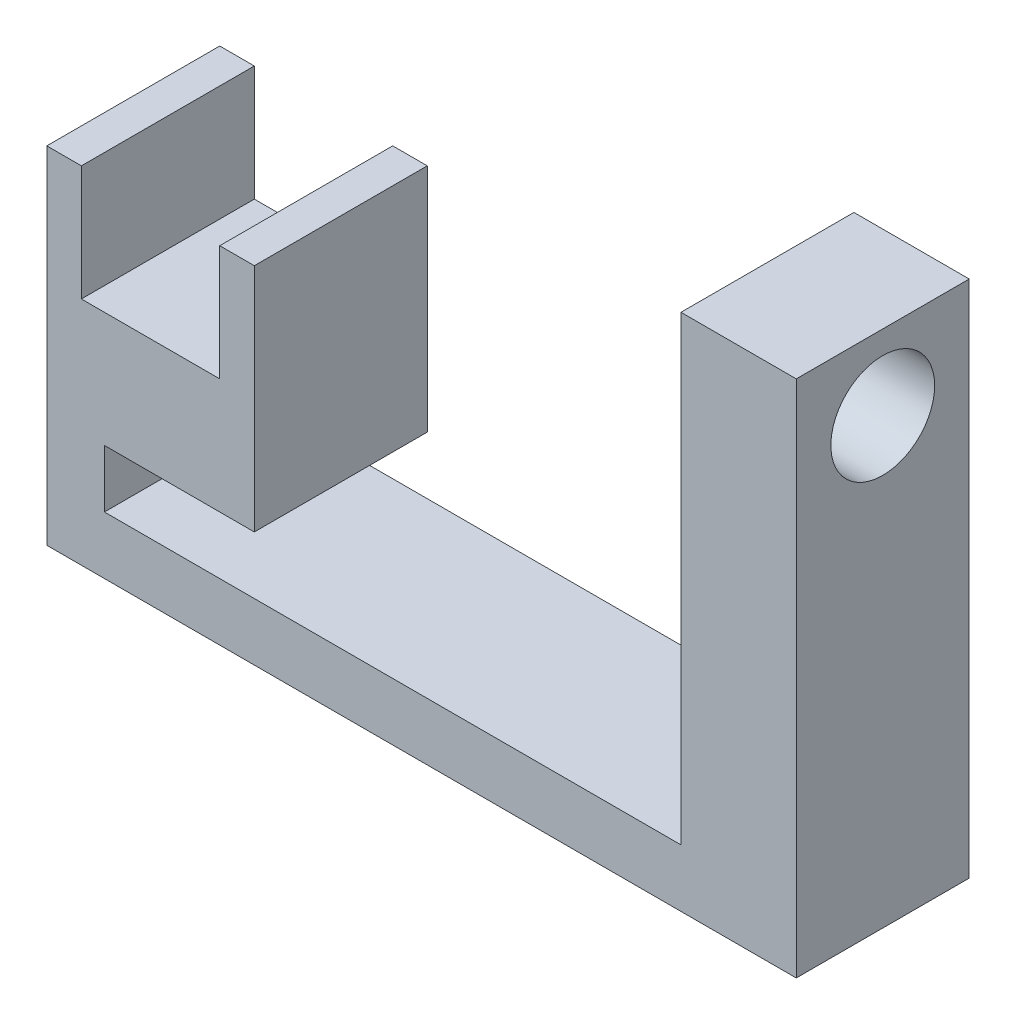
ISO-10303-21;
HEADER;
FILE_DESCRIPTION(('STEP AP214'),'2;1');
FILE_NAME('part.step','',(''),(''),'','','');
FILE_SCHEMA(('AUTOMOTIVE_DESIGN { 1 0 10303 214 1 1 1 1 }'));
ENDSEC;
DATA;
#1=APPLICATION_CONTEXT('core data for automotive mechanical design processes');
#2=APPLICATION_PROTOCOL_DEFINITION('international standard','automotive_design',2000,#1);
#3=PRODUCT_CONTEXT('',#1,'mechanical');
#4=PRODUCT('Part','Part','',(#3));
#5=PRODUCT_RELATED_PRODUCT_CATEGORY('part','',(#4));
#6=PRODUCT_DEFINITION_FORMATION('','',#4);
#7=PRODUCT_DEFINITION_CONTEXT('part definition',#1,'design');
#8=PRODUCT_DEFINITION('design','',#6,#7);
#9=PRODUCT_DEFINITION_SHAPE('','',#8);
#10=(LENGTH_UNIT() NAMED_UNIT(*) SI_UNIT(.MILLI.,.METRE.));
#11=(NAMED_UNIT(*) PLANE_ANGLE_UNIT() SI_UNIT($,.RADIAN.));
#12=(NAMED_UNIT(*) SI_UNIT($,.STERADIAN.) SOLID_ANGLE_UNIT());
#13=UNCERTAINTY_MEASURE_WITH_UNIT(LENGTH_MEASURE(1.E-05),#10,'distance_accuracy_value','');
#14=(GEOMETRIC_REPRESENTATION_CONTEXT(3) GLOBAL_UNCERTAINTY_ASSIGNED_CONTEXT((#13)) GLOBAL_UNIT_ASSIGNED_CONTEXT((#10,
#11,#12)) REPRESENTATION_CONTEXT('',''));
#15=CARTESIAN_POINT('',(0.,0.,0.));
#16=DIRECTION('',(0.,0.,1.));
#17=DIRECTION('',(1.,0.,0.));
#18=AXIS2_PLACEMENT_3D('',#15,#16,#17);
#19=CARTESIAN_POINT('',(0.,0.,15.));
#20=DIRECTION('',(0.,-1.,0.));
#21=DIRECTION('',(0.,0.,-1.));
#22=AXIS2_PLACEMENT_3D('',#19,#20,#21);
#23=PLANE('',#22);
#24=DIRECTION('',(-1.,0.,0.));
#25=VECTOR('',#24,1.);
#26=CARTESIAN_POINT('',(0.,0.,0.));
#27=LINE('',#26,#25);
#28=CARTESIAN_POINT('',(3.,0.,0.));
#29=VERTEX_POINT('',#28);
#30=CARTESIAN_POINT('',(0.,0.,0.));
#31=VERTEX_POINT('',#30);
#32=EDGE_CURVE('E177',#29,#31,#27,.T.);
#33=ORIENTED_EDGE('',*,*,#32,.T.);
#34=DIRECTION('',(0.,0.,-1.));
#35=VECTOR('',#34,1.);
#36=CARTESIAN_POINT('',(0.,0.,15.));
#37=LINE('',#36,#35);
#38=CARTESIAN_POINT('',(0.,0.,15.));
#39=VERTEX_POINT('',#38);
#40=EDGE_CURVE('E11',#39,#31,#37,.T.);
#41=ORIENTED_EDGE('',*,*,#40,.F.);
#42=DIRECTION('',(-1.,0.,0.));
#43=VECTOR('',#42,1.);
#44=CARTESIAN_POINT('',(0.,0.,15.));
#45=LINE('',#44,#43);
#46=CARTESIAN_POINT('',(3.,0.,15.));
#47=VERTEX_POINT('',#46);
#48=EDGE_CURVE('E217',#47,#39,#45,.T.);
#49=ORIENTED_EDGE('',*,*,#48,.F.);
#50=DIRECTION('',(0.,0.,-1.));
#51=VECTOR('',#50,1.);
#52=CARTESIAN_POINT('',(3.,0.,15.));
#53=LINE('',#52,#51);
#54=EDGE_CURVE('E173',#47,#29,#53,.T.);
#55=ORIENTED_EDGE('',*,*,#54,.T.);
#56=EDGE_LOOP('',(#33,#41,#49,#55));
#57=FACE_BOUND('',#56,.T.);
#58=ADVANCED_FACE('F39',(#57),#23,.F.);
#59=CARTESIAN_POINT('',(0.,-20.,15.));
#60=DIRECTION('',(1.,0.,0.));
#61=DIRECTION('',(0.,1.,0.));
#62=AXIS2_PLACEMENT_3D('',#59,#60,#61);
#63=PLANE('',#62);
#64=DIRECTION('',(0.,-1.,0.));
#65=VECTOR('',#64,1.);
#66=CARTESIAN_POINT('',(0.,-20.,0.));
#67=LINE('',#66,#65);
#68=CARTESIAN_POINT('',(0.,-30.,0.));
#69=VERTEX_POINT('',#68);
#70=EDGE_CURVE('E181',#31,#69,#67,.T.);
#71=ORIENTED_EDGE('',*,*,#70,.T.);
#72=DIRECTION('',(0.,0.,-1.));
#73=VECTOR('',#72,1.);
#74=CARTESIAN_POINT('',(0.,-30.,15.));
#75=LINE('',#74,#73);
#76=CARTESIAN_POINT('',(0.,-30.,15.));
#77=VERTEX_POINT('',#76);
#78=EDGE_CURVE('E49',#77,#69,#75,.T.);
#79=ORIENTED_EDGE('',*,*,#78,.F.);
#80=DIRECTION('',(0.,-1.,0.));
#81=VECTOR('',#80,1.);
#82=CARTESIAN_POINT('',(0.,0.,15.));
#83=LINE('',#82,#81);
#84=EDGE_CURVE('E118',#39,#77,#83,.T.);
#85=ORIENTED_EDGE('',*,*,#84,.F.);
#86=ORIENTED_EDGE('',*,*,#40,.T.);
#87=EDGE_LOOP('',(#71,#79,#85,#86));
#88=FACE_BOUND('',#87,.T.);
#89=ADVANCED_FACE('F326',(#88),#63,.F.);
#90=CARTESIAN_POINT('',(0.,-30.,15.));
#91=DIRECTION('',(0.,1.,0.));
#92=DIRECTION('',(-1.,0.,0.));
#93=AXIS2_PLACEMENT_3D('',#90,#91,#92);
#94=PLANE('',#93);
#95=DIRECTION('',(1.,0.,0.));
#96=VECTOR('',#95,1.);
#97=CARTESIAN_POINT('',(0.,-30.,0.));
#98=LINE('',#97,#96);
#99=CARTESIAN_POINT('',(65.,-30.,0.));
#100=VERTEX_POINT('',#99);
#101=EDGE_CURVE('E184',#69,#100,#98,.T.);
#102=ORIENTED_EDGE('',*,*,#101,.T.);
#103=DIRECTION('',(0.,0.,-1.));
#104=VECTOR('',#103,1.);
#105=CARTESIAN_POINT('',(65.,-30.,15.));
#106=LINE('',#105,#104);
#107=CARTESIAN_POINT('',(65.,-30.,15.));
#108=VERTEX_POINT('',#107);
#109=EDGE_CURVE('E252',#108,#100,#106,.T.);
#110=ORIENTED_EDGE('',*,*,#109,.F.);
#111=DIRECTION('',(1.,0.,0.));
#112=VECTOR('',#111,1.);
#113=CARTESIAN_POINT('',(0.,-30.,15.));
#114=LINE('',#113,#112);
#115=EDGE_CURVE('E263',#77,#108,#114,.T.);
#116=ORIENTED_EDGE('',*,*,#115,.F.);
#117=ORIENTED_EDGE('',*,*,#78,.T.);
#118=EDGE_LOOP('',(#102,#110,#116,#117));
#119=FACE_BOUND('',#118,.T.);
#120=ADVANCED_FACE('F261',(#119),#94,.F.);
#121=CARTESIAN_POINT('',(65.,15.,15.));
#122=DIRECTION('',(-1.,0.,0.));
#123=DIRECTION('',(0.,0.,1.));
#124=AXIS2_PLACEMENT_3D('',#121,#122,#123);
#125=PLANE('',#124);
#126=CARTESIAN_POINT('',(65.,8.5,7.5));
#127=DIRECTION('',(1.,0.,0.));
#128=DIRECTION('',(0.,0.,-1.));
#129=AXIS2_PLACEMENT_3D('',#126,#127,#128);
#130=CIRCLE('',#129,4.5);
#131=CARTESIAN_POINT('',(65.,8.5,3.));
#132=VERTEX_POINT('',#131);
#133=EDGE_CURVE('E418',#132,#132,#130,.T.);
#134=ORIENTED_EDGE('',*,*,#133,.F.);
#135=EDGE_LOOP('',(#134));
#136=FACE_BOUND('',#135,.T.);
#137=DIRECTION('',(0.,1.,0.));
#138=VECTOR('',#137,1.);
#139=CARTESIAN_POINT('',(65.,15.,0.));
#140=LINE('',#139,#138);
#141=CARTESIAN_POINT('',(65.,15.,0.));
#142=VERTEX_POINT('',#141);
#143=EDGE_CURVE('E187',#100,#142,#140,.T.);
#144=ORIENTED_EDGE('',*,*,#143,.T.);
#145=DIRECTION('',(0.,0.,-1.));
#146=VECTOR('',#145,1.);
#147=CARTESIAN_POINT('',(65.,15.,15.));
#148=LINE('',#147,#146);
#149=CARTESIAN_POINT('',(65.,15.,15.));
#150=VERTEX_POINT('',#149);
#151=EDGE_CURVE('E248',#150,#142,#148,.T.);
#152=ORIENTED_EDGE('',*,*,#151,.F.);
#153=DIRECTION('',(0.,1.,0.));
#154=VECTOR('',#153,1.);
#155=CARTESIAN_POINT('',(65.,15.,15.));
#156=LINE('',#155,#154);
#157=EDGE_CURVE('E282',#108,#150,#156,.T.);
#158=ORIENTED_EDGE('',*,*,#157,.F.);
#159=ORIENTED_EDGE('',*,*,#109,.T.);
#160=EDGE_LOOP('',(#144,#152,#158,#159));
#161=FACE_BOUND('',#160,.T.);
#162=ADVANCED_FACE('F272',(#136,#161),#125,.F.);
#163=CARTESIAN_POINT('',(55.,15.,15.));
#164=DIRECTION('',(0.,-1.,0.));
#165=DIRECTION('',(0.,0.,-1.));
#166=AXIS2_PLACEMENT_3D('',#163,#164,#165);
#167=PLANE('',#166);
#168=DIRECTION('',(-1.,0.,0.));
#169=VECTOR('',#168,1.);
#170=CARTESIAN_POINT('',(55.,15.,0.));
#171=LINE('',#170,#169);
#172=CARTESIAN_POINT('',(55.,15.,0.));
#173=VERTEX_POINT('',#172);
#174=EDGE_CURVE('E190',#142,#173,#171,.T.);
#175=ORIENTED_EDGE('',*,*,#174,.T.);
#176=DIRECTION('',(0.,0.,-1.));
#177=VECTOR('',#176,1.);
#178=CARTESIAN_POINT('',(55.,15.,15.));
#179=LINE('',#178,#177);
#180=CARTESIAN_POINT('',(55.,15.,15.));
#181=VERTEX_POINT('',#180);
#182=EDGE_CURVE('E244',#181,#173,#179,.T.);
#183=ORIENTED_EDGE('',*,*,#182,.F.);
#184=DIRECTION('',(-1.,0.,0.));
#185=VECTOR('',#184,1.);
#186=CARTESIAN_POINT('',(55.,15.,15.));
#187=LINE('',#186,#185);
#188=EDGE_CURVE('E278',#150,#181,#187,.T.);
#189=ORIENTED_EDGE('',*,*,#188,.F.);
#190=ORIENTED_EDGE('',*,*,#151,.T.);
#191=EDGE_LOOP('',(#175,#183,#189,#190));
#192=FACE_BOUND('',#191,.T.);
#193=ADVANCED_FACE('F276',(#192),#167,.F.);
#194=CARTESIAN_POINT('',(55.,-25.,15.));
#195=DIRECTION('',(1.,0.,0.));
#196=DIRECTION('',(0.,0.,-1.));
#197=AXIS2_PLACEMENT_3D('',#194,#195,#196);
#198=PLANE('',#197);
#199=CARTESIAN_POINT('',(55.,8.5,7.5));
#200=DIRECTION('',(1.,0.,0.));
#201=DIRECTION('',(0.,0.,-1.));
#202=AXIS2_PLACEMENT_3D('',#199,#200,#201);
#203=CIRCLE('',#202,4.5);
#204=CARTESIAN_POINT('',(55.,8.5,3.));
#205=VERTEX_POINT('',#204);
#206=EDGE_CURVE('E42',#205,#205,#203,.T.);
#207=ORIENTED_EDGE('',*,*,#206,.T.);
#208=EDGE_LOOP('',(#207));
#209=FACE_BOUND('',#208,.T.);
#210=DIRECTION('',(0.,-1.,0.));
#211=VECTOR('',#210,1.);
#212=CARTESIAN_POINT('',(55.,-25.,0.));
#213=LINE('',#212,#211);
#214=CARTESIAN_POINT('',(55.,-25.,0.));
#215=VERTEX_POINT('',#214);
#216=EDGE_CURVE('E193',#173,#215,#213,.T.);
#217=ORIENTED_EDGE('',*,*,#216,.T.);
#218=DIRECTION('',(0.,0.,-1.));
#219=VECTOR('',#218,1.);
#220=CARTESIAN_POINT('',(55.,-25.,15.));
#221=LINE('',#220,#219);
#222=CARTESIAN_POINT('',(55.,-25.,15.));
#223=VERTEX_POINT('',#222);
#224=EDGE_CURVE('E240',#223,#215,#221,.T.);
#225=ORIENTED_EDGE('',*,*,#224,.F.);
#226=DIRECTION('',(0.,-1.,0.));
#227=VECTOR('',#226,1.);
#228=CARTESIAN_POINT('',(55.,-25.,15.));
#229=LINE('',#228,#227);
#230=EDGE_CURVE('E281',#181,#223,#229,.T.);
#231=ORIENTED_EDGE('',*,*,#230,.F.);
#232=ORIENTED_EDGE('',*,*,#182,.T.);
#233=EDGE_LOOP('',(#217,#225,#231,#232));
#234=FACE_BOUND('',#233,.T.);
#235=ADVANCED_FACE('F340',(#209,#234),#198,.F.);
#236=CARTESIAN_POINT('',(5.00000000000001,-25.,15.));
#237=DIRECTION('',(0.,-1.,0.));
#238=DIRECTION('',(0.,0.,-1.));
#239=AXIS2_PLACEMENT_3D('',#236,#237,#238);
#240=PLANE('',#239);
#241=DIRECTION('',(-1.,0.,0.));
#242=VECTOR('',#241,1.);
#243=CARTESIAN_POINT('',(5.00000000000001,-25.,0.));
#244=LINE('',#243,#242);
#245=CARTESIAN_POINT('',(5.00000000000001,-25.,0.));
#246=VERTEX_POINT('',#245);
#247=EDGE_CURVE('E196',#215,#246,#244,.T.);
#248=ORIENTED_EDGE('',*,*,#247,.T.);
#249=DIRECTION('',(0.,0.,-1.));
#250=VECTOR('',#249,1.);
#251=CARTESIAN_POINT('',(5.00000000000001,-25.,15.));
#252=LINE('',#251,#250);
#253=CARTESIAN_POINT('',(5.00000000000001,-25.,15.));
#254=VERTEX_POINT('',#253);
#255=EDGE_CURVE('E236',#254,#246,#252,.T.);
#256=ORIENTED_EDGE('',*,*,#255,.F.);
#257=DIRECTION('',(-1.,0.,0.));
#258=VECTOR('',#257,1.);
#259=CARTESIAN_POINT('',(5.00000000000001,-25.,15.));
#260=LINE('',#259,#258);
#261=EDGE_CURVE('E286',#223,#254,#260,.T.);
#262=ORIENTED_EDGE('',*,*,#261,.F.);
#263=ORIENTED_EDGE('',*,*,#224,.T.);
#264=EDGE_LOOP('',(#248,#256,#262,#263));
#265=FACE_BOUND('',#264,.T.);
#266=ADVANCED_FACE('F343',(#265),#240,.F.);
#267=CARTESIAN_POINT('',(5.,-20.,15.));
#268=DIRECTION('',(-1.,0.,0.));
#269=DIRECTION('',(0.,-1.,0.));
#270=AXIS2_PLACEMENT_3D('',#267,#268,#269);
#271=PLANE('',#270);
#272=DIRECTION('',(0.,1.,0.));
#273=VECTOR('',#272,1.);
#274=CARTESIAN_POINT('',(5.,-20.,0.));
#275=LINE('',#274,#273);
#276=CARTESIAN_POINT('',(5.,-20.,0.));
#277=VERTEX_POINT('',#276);
#278=EDGE_CURVE('E199',#246,#277,#275,.T.);
#279=ORIENTED_EDGE('',*,*,#278,.T.);
#280=DIRECTION('',(0.,0.,-1.));
#281=VECTOR('',#280,1.);
#282=CARTESIAN_POINT('',(5.,-20.,15.));
#283=LINE('',#282,#281);
#284=CARTESIAN_POINT('',(5.,-20.,15.));
#285=VERTEX_POINT('',#284);
#286=EDGE_CURVE('E232',#285,#277,#283,.T.);
#287=ORIENTED_EDGE('',*,*,#286,.F.);
#288=DIRECTION('',(0.,1.,0.));
#289=VECTOR('',#288,1.);
#290=CARTESIAN_POINT('',(5.,-20.,15.));
#291=LINE('',#290,#289);
#292=EDGE_CURVE('E293',#254,#285,#291,.T.);
#293=ORIENTED_EDGE('',*,*,#292,.F.);
#294=ORIENTED_EDGE('',*,*,#255,.T.);
#295=EDGE_LOOP('',(#279,#287,#293,#294));
#296=FACE_BOUND('',#295,.T.);
#297=ADVANCED_FACE('F347',(#296),#271,.F.);
#298=CARTESIAN_POINT('',(18.,-20.,15.));
#299=DIRECTION('',(0.,1.,0.));
#300=DIRECTION('',(0.,0.,1.));
#301=AXIS2_PLACEMENT_3D('',#298,#299,#300);
#302=PLANE('',#301);
#303=DIRECTION('',(1.,0.,0.));
#304=VECTOR('',#303,1.);
#305=CARTESIAN_POINT('',(18.,-20.,0.));
#306=LINE('',#305,#304);
#307=CARTESIAN_POINT('',(18.,-20.,0.));
#308=VERTEX_POINT('',#307);
#309=EDGE_CURVE('E202',#277,#308,#306,.T.);
#310=ORIENTED_EDGE('',*,*,#309,.T.);
#311=DIRECTION('',(0.,0.,-1.));
#312=VECTOR('',#311,1.);
#313=CARTESIAN_POINT('',(18.,-20.,15.));
#314=LINE('',#313,#312);
#315=CARTESIAN_POINT('',(18.,-20.,15.));
#316=VERTEX_POINT('',#315);
#317=EDGE_CURVE('E228',#316,#308,#314,.T.);
#318=ORIENTED_EDGE('',*,*,#317,.F.);
#319=DIRECTION('',(1.,0.,0.));
#320=VECTOR('',#319,1.);
#321=CARTESIAN_POINT('',(18.,-20.,15.));
#322=LINE('',#321,#320);
#323=EDGE_CURVE('E296',#285,#316,#322,.T.);
#324=ORIENTED_EDGE('',*,*,#323,.F.);
#325=ORIENTED_EDGE('',*,*,#286,.T.);
#326=EDGE_LOOP('',(#310,#318,#324,#325));
#327=FACE_BOUND('',#326,.T.);
#328=ADVANCED_FACE('F351',(#327),#302,.F.);
#329=CARTESIAN_POINT('',(18.,0.,15.));
#330=DIRECTION('',(-1.,0.,0.));
#331=DIRECTION('',(0.,-1.,0.));
#332=AXIS2_PLACEMENT_3D('',#329,#330,#331);
#333=PLANE('',#332);
#334=DIRECTION('',(0.,1.,0.));
#335=VECTOR('',#334,1.);
#336=CARTESIAN_POINT('',(18.,0.,0.));
#337=LINE('',#336,#335);
#338=CARTESIAN_POINT('',(18.,0.,0.));
#339=VERTEX_POINT('',#338);
#340=EDGE_CURVE('E205',#308,#339,#337,.T.);
#341=ORIENTED_EDGE('',*,*,#340,.T.);
#342=DIRECTION('',(0.,0.,-1.));
#343=VECTOR('',#342,1.);
#344=CARTESIAN_POINT('',(18.,0.,15.));
#345=LINE('',#344,#343);
#346=CARTESIAN_POINT('',(18.,0.,15.));
#347=VERTEX_POINT('',#346);
#348=EDGE_CURVE('E224',#347,#339,#345,.T.);
#349=ORIENTED_EDGE('',*,*,#348,.F.);
#350=DIRECTION('',(0.,1.,0.));
#351=VECTOR('',#350,1.);
#352=CARTESIAN_POINT('',(18.,0.,15.));
#353=LINE('',#352,#351);
#354=EDGE_CURVE('E299',#316,#347,#353,.T.);
#355=ORIENTED_EDGE('',*,*,#354,.F.);
#356=ORIENTED_EDGE('',*,*,#317,.T.);
#357=EDGE_LOOP('',(#341,#349,#355,#356));
#358=FACE_BOUND('',#357,.T.);
#359=ADVANCED_FACE('F307',(#358),#333,.F.);
#360=CARTESIAN_POINT('',(15.,0.,15.));
#361=DIRECTION('',(0.,-1.,0.));
#362=DIRECTION('',(0.,0.,-1.));
#363=AXIS2_PLACEMENT_3D('',#360,#361,#362);
#364=PLANE('',#363);
#365=DIRECTION('',(-1.,0.,0.));
#366=VECTOR('',#365,1.);
#367=CARTESIAN_POINT('',(15.,0.,0.));
#368=LINE('',#367,#366);
#369=CARTESIAN_POINT('',(15.,0.,0.));
#370=VERTEX_POINT('',#369);
#371=EDGE_CURVE('E208',#339,#370,#368,.T.);
#372=ORIENTED_EDGE('',*,*,#371,.T.);
#373=DIRECTION('',(0.,0.,-1.));
#374=VECTOR('',#373,1.);
#375=CARTESIAN_POINT('',(15.,0.,15.));
#376=LINE('',#375,#374);
#377=CARTESIAN_POINT('',(15.,0.,15.));
#378=VERTEX_POINT('',#377);
#379=EDGE_CURVE('E166',#378,#370,#376,.T.);
#380=ORIENTED_EDGE('',*,*,#379,.F.);
#381=DIRECTION('',(-1.,0.,0.));
#382=VECTOR('',#381,1.);
#383=CARTESIAN_POINT('',(15.,0.,15.));
#384=LINE('',#383,#382);
#385=EDGE_CURVE('E155',#347,#378,#384,.T.);
#386=ORIENTED_EDGE('',*,*,#385,.F.);
#387=ORIENTED_EDGE('',*,*,#348,.T.);
#388=EDGE_LOOP('',(#372,#380,#386,#387));
#389=FACE_BOUND('',#388,.T.);
#390=ADVANCED_FACE('F311',(#389),#364,.F.);
#391=CARTESIAN_POINT('',(15.,-10.,15.));
#392=DIRECTION('',(1.,0.,0.));
#393=DIRECTION('',(0.,0.,-1.));
#394=AXIS2_PLACEMENT_3D('',#391,#392,#393);
#395=PLANE('',#394);
#396=DIRECTION('',(0.,-1.,0.));
#397=VECTOR('',#396,1.);
#398=CARTESIAN_POINT('',(15.,-10.,0.));
#399=LINE('',#398,#397);
#400=CARTESIAN_POINT('',(15.,-10.,0.));
#401=VERTEX_POINT('',#400);
#402=EDGE_CURVE('E164',#370,#401,#399,.T.);
#403=ORIENTED_EDGE('',*,*,#402,.T.);
#404=DIRECTION('',(0.,0.,-1.));
#405=VECTOR('',#404,1.);
#406=CARTESIAN_POINT('',(15.,-10.,15.));
#407=LINE('',#406,#405);
#408=CARTESIAN_POINT('',(15.,-10.,15.));
#409=VERTEX_POINT('',#408);
#410=EDGE_CURVE('E161',#409,#401,#407,.T.);
#411=ORIENTED_EDGE('',*,*,#410,.F.);
#412=DIRECTION('',(0.,-1.,0.));
#413=VECTOR('',#412,1.);
#414=CARTESIAN_POINT('',(15.,-10.,15.));
#415=LINE('',#414,#413);
#416=EDGE_CURVE('E149',#378,#409,#415,.T.);
#417=ORIENTED_EDGE('',*,*,#416,.F.);
#418=ORIENTED_EDGE('',*,*,#379,.T.);
#419=EDGE_LOOP('',(#403,#411,#417,#418));
#420=FACE_BOUND('',#419,.T.);
#421=ADVANCED_FACE('F162',(#420),#395,.F.);
#422=CARTESIAN_POINT('',(3.,-10.,15.));
#423=DIRECTION('',(0.,-1.,0.));
#424=DIRECTION('',(0.,0.,-1.));
#425=AXIS2_PLACEMENT_3D('',#422,#423,#424);
#426=PLANE('',#425);
#427=DIRECTION('',(-1.,0.,0.));
#428=VECTOR('',#427,1.);
#429=CARTESIAN_POINT('',(3.,-10.,0.));
#430=LINE('',#429,#428);
#431=CARTESIAN_POINT('',(3.,-10.,0.));
#432=VERTEX_POINT('',#431);
#433=EDGE_CURVE('E104',#401,#432,#430,.T.);
#434=ORIENTED_EDGE('',*,*,#433,.T.);
#435=DIRECTION('',(0.,0.,-1.));
#436=VECTOR('',#435,1.);
#437=CARTESIAN_POINT('',(3.,-10.,15.));
#438=LINE('',#437,#436);
#439=CARTESIAN_POINT('',(3.,-10.,15.));
#440=VERTEX_POINT('',#439);
#441=EDGE_CURVE('E167',#440,#432,#438,.T.);
#442=ORIENTED_EDGE('',*,*,#441,.F.);
#443=DIRECTION('',(-1.,0.,0.));
#444=VECTOR('',#443,1.);
#445=CARTESIAN_POINT('',(3.,-10.,15.));
#446=LINE('',#445,#444);
#447=EDGE_CURVE('E153',#409,#440,#446,.T.);
#448=ORIENTED_EDGE('',*,*,#447,.F.);
#449=ORIENTED_EDGE('',*,*,#410,.T.);
#450=EDGE_LOOP('',(#434,#442,#448,#449));
#451=FACE_BOUND('',#450,.T.);
#452=ADVANCED_FACE('F169',(#451),#426,.F.);
#453=CARTESIAN_POINT('',(3.,0.,15.));
#454=DIRECTION('',(-1.,0.,0.));
#455=DIRECTION('',(0.,-1.,0.));
#456=AXIS2_PLACEMENT_3D('',#453,#454,#455);
#457=PLANE('',#456);
#458=DIRECTION('',(0.,1.,0.));
#459=VECTOR('',#458,1.);
#460=CARTESIAN_POINT('',(3.,0.,0.));
#461=LINE('',#460,#459);
#462=EDGE_CURVE('E110',#432,#29,#461,.T.);
#463=ORIENTED_EDGE('',*,*,#462,.T.);
#464=ORIENTED_EDGE('',*,*,#54,.F.);
#465=DIRECTION('',(0.,1.,0.));
#466=VECTOR('',#465,1.);
#467=CARTESIAN_POINT('',(3.,0.,15.));
#468=LINE('',#467,#466);
#469=EDGE_CURVE('E57',#440,#47,#468,.T.);
#470=ORIENTED_EDGE('',*,*,#469,.F.);
#471=ORIENTED_EDGE('',*,*,#441,.T.);
#472=EDGE_LOOP('',(#463,#464,#470,#471));
#473=FACE_BOUND('',#472,.T.);
#474=ADVANCED_FACE('F315',(#473),#457,.F.);
#475=CARTESIAN_POINT('',(0.,0.,15.));
#476=DIRECTION('',(0.,0.,-1.));
#477=DIRECTION('',(-1.,0.,0.));
#478=AXIS2_PLACEMENT_3D('',#475,#476,#477);
#479=PLANE('',#478);
#480=ORIENTED_EDGE('',*,*,#48,.T.);
#481=ORIENTED_EDGE('',*,*,#84,.T.);
#482=ORIENTED_EDGE('',*,*,#115,.T.);
#483=ORIENTED_EDGE('',*,*,#157,.T.);
#484=ORIENTED_EDGE('',*,*,#188,.T.);
#485=ORIENTED_EDGE('',*,*,#230,.T.);
#486=ORIENTED_EDGE('',*,*,#261,.T.);
#487=ORIENTED_EDGE('',*,*,#292,.T.);
#488=ORIENTED_EDGE('',*,*,#323,.T.);
#489=ORIENTED_EDGE('',*,*,#354,.T.);
#490=ORIENTED_EDGE('',*,*,#385,.T.);
#491=ORIENTED_EDGE('',*,*,#416,.T.);
#492=ORIENTED_EDGE('',*,*,#447,.T.);
#493=ORIENTED_EDGE('',*,*,#469,.T.);
#494=EDGE_LOOP('',(#480,#481,#482,#483,#484,#485,#486,#487,#488,#489,#490,#491,#492,#493));
#495=FACE_BOUND('',#494,.T.);
#496=ADVANCED_FACE('F151',(#495),#479,.F.);
#497=CARTESIAN_POINT('',(0.,0.,0.));
#498=DIRECTION('',(0.,0.,-1.));
#499=DIRECTION('',(-1.,0.,0.));
#500=AXIS2_PLACEMENT_3D('',#497,#498,#499);
#501=PLANE('',#500);
#502=ORIENTED_EDGE('',*,*,#32,.F.);
#503=ORIENTED_EDGE('',*,*,#462,.F.);
#504=ORIENTED_EDGE('',*,*,#433,.F.);
#505=ORIENTED_EDGE('',*,*,#402,.F.);
#506=ORIENTED_EDGE('',*,*,#371,.F.);
#507=ORIENTED_EDGE('',*,*,#340,.F.);
#508=ORIENTED_EDGE('',*,*,#309,.F.);
#509=ORIENTED_EDGE('',*,*,#278,.F.);
#510=ORIENTED_EDGE('',*,*,#247,.F.);
#511=ORIENTED_EDGE('',*,*,#216,.F.);
#512=ORIENTED_EDGE('',*,*,#174,.F.);
#513=ORIENTED_EDGE('',*,*,#143,.F.);
#514=ORIENTED_EDGE('',*,*,#101,.F.);
#515=ORIENTED_EDGE('',*,*,#70,.F.);
#516=EDGE_LOOP('',(#502,#503,#504,#505,#506,#507,#508,#509,#510,#511,#512,#513,#514,#515));
#517=FACE_BOUND('',#516,.T.);
#518=ADVANCED_FACE('F267',(#517),#501,.T.);
#519=CARTESIAN_POINT('',(50.,8.5,7.5));
#520=DIRECTION('',(1.,0.,0.));
#521=DIRECTION('',(0.,0.,-1.));
#522=AXIS2_PLACEMENT_3D('',#519,#520,#521);
#523=CYLINDRICAL_SURFACE('',#522,4.5);
#524=ORIENTED_EDGE('',*,*,#133,.T.);
#525=EDGE_LOOP('',(#524));
#526=FACE_BOUND('',#525,.T.);
#527=ORIENTED_EDGE('',*,*,#206,.F.);
#528=EDGE_LOOP('',(#527));
#529=FACE_BOUND('',#528,.T.);
#530=ADVANCED_FACE('F388',(#526,#529),#523,.F.);
#531=CLOSED_SHELL('',(#58,#89,#120,#162,#193,#235,#266,#297,#328,#359,#390,#421,#452,#474,#496,
#518,#530));
#532=MANIFOLD_SOLID_BREP('B2',#531);
#533=ADVANCED_BREP_SHAPE_REPRESENTATION('',(#18,#532),#14);
#534=SHAPE_DEFINITION_REPRESENTATION(#9,#533);
ENDSEC;
END-ISO-10303-21;
